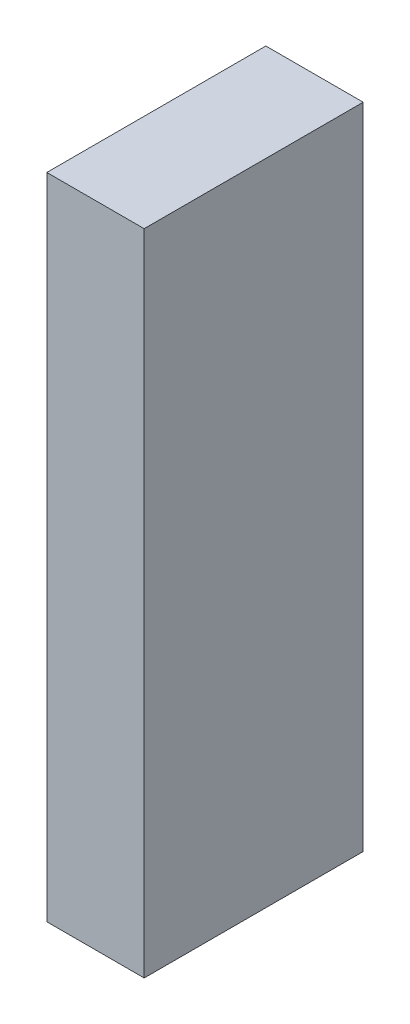
ISO-10303-21;
HEADER;
FILE_DESCRIPTION(('STEP AP214'),'2;1');
FILE_NAME('part.step','',(''),(''),'','','');
FILE_SCHEMA(('AUTOMOTIVE_DESIGN { 1 0 10303 214 1 1 1 1 }'));
ENDSEC;
DATA;
#1=APPLICATION_CONTEXT('core data for automotive mechanical design processes');
#2=APPLICATION_PROTOCOL_DEFINITION('international standard','automotive_design',2000,#1);
#3=PRODUCT_CONTEXT('',#1,'mechanical');
#4=PRODUCT('Part','Part','',(#3));
#5=PRODUCT_RELATED_PRODUCT_CATEGORY('part','',(#4));
#6=PRODUCT_DEFINITION_FORMATION('','',#4);
#7=PRODUCT_DEFINITION_CONTEXT('part definition',#1,'design');
#8=PRODUCT_DEFINITION('design','',#6,#7);
#9=PRODUCT_DEFINITION_SHAPE('','',#8);
#10=(LENGTH_UNIT() NAMED_UNIT(*) SI_UNIT(.MILLI.,.METRE.));
#11=(NAMED_UNIT(*) PLANE_ANGLE_UNIT() SI_UNIT($,.RADIAN.));
#12=(NAMED_UNIT(*) SI_UNIT($,.STERADIAN.) SOLID_ANGLE_UNIT());
#13=UNCERTAINTY_MEASURE_WITH_UNIT(LENGTH_MEASURE(1.E-05),#10,'distance_accuracy_value','');
#14=(GEOMETRIC_REPRESENTATION_CONTEXT(3) GLOBAL_UNCERTAINTY_ASSIGNED_CONTEXT((#13)) GLOBAL_UNIT_ASSIGNED_CONTEXT((#10,
#11,#12)) REPRESENTATION_CONTEXT('',''));
#15=CARTESIAN_POINT('',(0.,0.,0.));
#16=DIRECTION('',(0.,0.,1.));
#17=DIRECTION('',(1.,0.,0.));
#18=AXIS2_PLACEMENT_3D('',#15,#16,#17);
#19=CARTESIAN_POINT('',(-10.8340585797146,40.,-105.756692970029));
#20=DIRECTION('',(-1.,0.,0.));
#21=DIRECTION('',(0.,0.,1.));
#22=AXIS2_PLACEMENT_3D('',#19,#20,#21);
#23=PLANE('',#22);
#24=DIRECTION('',(0.,0.,-1.));
#25=VECTOR('',#24,1.);
#26=CARTESIAN_POINT('',(-10.8340585797146,0.,-105.756692970029));
#27=LINE('',#26,#25);
#28=CARTESIAN_POINT('',(-10.8340585797146,0.,-92.2566929700289));
#29=VERTEX_POINT('',#28);
#30=CARTESIAN_POINT('',(-10.8340585797146,0.,-105.756692970029));
#31=VERTEX_POINT('',#30);
#32=EDGE_CURVE('E101',#29,#31,#27,.T.);
#33=ORIENTED_EDGE('',*,*,#32,.T.);
#34=DIRECTION('',(0.,-1.,0.));
#35=VECTOR('',#34,1.);
#36=CARTESIAN_POINT('',(-10.8340585797146,40.,-105.756692970029));
#37=LINE('',#36,#35);
#38=CARTESIAN_POINT('',(-10.8340585797146,40.,-105.756692970029));
#39=VERTEX_POINT('',#38);
#40=EDGE_CURVE('E11',#39,#31,#37,.T.);
#41=ORIENTED_EDGE('',*,*,#40,.F.);
#42=DIRECTION('',(0.,0.,-1.));
#43=VECTOR('',#42,1.);
#44=CARTESIAN_POINT('',(-10.8340585797146,40.,-105.756692970029));
#45=LINE('',#44,#43);
#46=CARTESIAN_POINT('',(-10.8340585797146,40.,-92.2566929700289));
#47=VERTEX_POINT('',#46);
#48=EDGE_CURVE('E89',#47,#39,#45,.T.);
#49=ORIENTED_EDGE('',*,*,#48,.F.);
#50=DIRECTION('',(0.,-1.,0.));
#51=VECTOR('',#50,1.);
#52=CARTESIAN_POINT('',(-10.8340585797146,40.,-92.2566929700289));
#53=LINE('',#52,#51);
#54=EDGE_CURVE('E97',#47,#29,#53,.T.);
#55=ORIENTED_EDGE('',*,*,#54,.T.);
#56=EDGE_LOOP('',(#33,#41,#49,#55));
#57=FACE_BOUND('',#56,.T.);
#58=ADVANCED_FACE('F38',(#57),#23,.F.);
#59=CARTESIAN_POINT('',(-10.8340585797146,40.,-105.756692970029));
#60=DIRECTION('',(0.,0.,1.));
#61=DIRECTION('',(1.,0.,0.));
#62=AXIS2_PLACEMENT_3D('',#59,#60,#61);
#63=PLANE('',#62);
#64=DIRECTION('',(-1.,0.,0.));
#65=VECTOR('',#64,1.);
#66=CARTESIAN_POINT('',(-10.8340585797146,0.,-105.756692970029));
#67=LINE('',#66,#65);
#68=CARTESIAN_POINT('',(-16.8340585797146,0.,-105.756692970029));
#69=VERTEX_POINT('',#68);
#70=EDGE_CURVE('E93',#31,#69,#67,.T.);
#71=ORIENTED_EDGE('',*,*,#70,.T.);
#72=DIRECTION('',(0.,-1.,0.));
#73=VECTOR('',#72,1.);
#74=CARTESIAN_POINT('',(-16.8340585797146,40.,-105.756692970029));
#75=LINE('',#74,#73);
#76=CARTESIAN_POINT('',(-16.8340585797146,40.,-105.756692970029));
#77=VERTEX_POINT('',#76);
#78=EDGE_CURVE('E46',#77,#69,#75,.T.);
#79=ORIENTED_EDGE('',*,*,#78,.F.);
#80=DIRECTION('',(-1.,0.,0.));
#81=VECTOR('',#80,1.);
#82=CARTESIAN_POINT('',(-10.8340585797146,40.,-105.756692970029));
#83=LINE('',#82,#81);
#84=EDGE_CURVE('E84',#39,#77,#83,.T.);
#85=ORIENTED_EDGE('',*,*,#84,.F.);
#86=ORIENTED_EDGE('',*,*,#40,.T.);
#87=EDGE_LOOP('',(#71,#79,#85,#86));
#88=FACE_BOUND('',#87,.T.);
#89=ADVANCED_FACE('F92',(#88),#63,.F.);
#90=CARTESIAN_POINT('',(-16.8340585797146,40.,-105.756692970029));
#91=DIRECTION('',(1.,0.,0.));
#92=DIRECTION('',(0.,0.,-1.));
#93=AXIS2_PLACEMENT_3D('',#90,#91,#92);
#94=PLANE('',#93);
#95=DIRECTION('',(0.,0.,1.));
#96=VECTOR('',#95,1.);
#97=CARTESIAN_POINT('',(-16.8340585797146,0.,-105.756692970029));
#98=LINE('',#97,#96);
#99=CARTESIAN_POINT('',(-16.8340585797146,0.,-92.2566929700289));
#100=VERTEX_POINT('',#99);
#101=EDGE_CURVE('E71',#69,#100,#98,.T.);
#102=ORIENTED_EDGE('',*,*,#101,.T.);
#103=DIRECTION('',(0.,-1.,0.));
#104=VECTOR('',#103,1.);
#105=CARTESIAN_POINT('',(-16.8340585797146,40.,-92.2566929700289));
#106=LINE('',#105,#104);
#107=CARTESIAN_POINT('',(-16.8340585797146,40.,-92.2566929700289));
#108=VERTEX_POINT('',#107);
#109=EDGE_CURVE('E94',#108,#100,#106,.T.);
#110=ORIENTED_EDGE('',*,*,#109,.F.);
#111=DIRECTION('',(0.,0.,1.));
#112=VECTOR('',#111,1.);
#113=CARTESIAN_POINT('',(-16.8340585797146,40.,-105.756692970029));
#114=LINE('',#113,#112);
#115=EDGE_CURVE('E87',#77,#108,#114,.T.);
#116=ORIENTED_EDGE('',*,*,#115,.F.);
#117=ORIENTED_EDGE('',*,*,#78,.T.);
#118=EDGE_LOOP('',(#102,#110,#116,#117));
#119=FACE_BOUND('',#118,.T.);
#120=ADVANCED_FACE('F95',(#119),#94,.F.);
#121=CARTESIAN_POINT('',(-10.8340585797146,40.,-92.2566929700289));
#122=DIRECTION('',(0.,0.,-1.));
#123=DIRECTION('',(-1.,0.,0.));
#124=AXIS2_PLACEMENT_3D('',#121,#122,#123);
#125=PLANE('',#124);
#126=DIRECTION('',(1.,0.,0.));
#127=VECTOR('',#126,1.);
#128=CARTESIAN_POINT('',(-10.8340585797146,0.,-92.2566929700289));
#129=LINE('',#128,#127);
#130=EDGE_CURVE('E77',#100,#29,#129,.T.);
#131=ORIENTED_EDGE('',*,*,#130,.T.);
#132=ORIENTED_EDGE('',*,*,#54,.F.);
#133=DIRECTION('',(1.,0.,0.));
#134=VECTOR('',#133,1.);
#135=CARTESIAN_POINT('',(-10.8340585797146,40.,-92.2566929700289));
#136=LINE('',#135,#134);
#137=EDGE_CURVE('E54',#108,#47,#136,.T.);
#138=ORIENTED_EDGE('',*,*,#137,.F.);
#139=ORIENTED_EDGE('',*,*,#109,.T.);
#140=EDGE_LOOP('',(#131,#132,#138,#139));
#141=FACE_BOUND('',#140,.T.);
#142=ADVANCED_FACE('F108',(#141),#125,.F.);
#143=CARTESIAN_POINT('',(0.,40.,0.));
#144=DIRECTION('',(0.,-1.,0.));
#145=DIRECTION('',(0.,0.,-1.));
#146=AXIS2_PLACEMENT_3D('',#143,#144,#145);
#147=PLANE('',#146);
#148=ORIENTED_EDGE('',*,*,#48,.T.);
#149=ORIENTED_EDGE('',*,*,#84,.T.);
#150=ORIENTED_EDGE('',*,*,#115,.T.);
#151=ORIENTED_EDGE('',*,*,#137,.T.);
#152=EDGE_LOOP('',(#148,#149,#150,#151));
#153=FACE_BOUND('',#152,.T.);
#154=ADVANCED_FACE('F85',(#153),#147,.F.);
#155=CARTESIAN_POINT('',(0.,0.,0.));
#156=DIRECTION('',(0.,-1.,0.));
#157=DIRECTION('',(0.,0.,-1.));
#158=AXIS2_PLACEMENT_3D('',#155,#156,#157);
#159=PLANE('',#158);
#160=ORIENTED_EDGE('',*,*,#32,.F.);
#161=ORIENTED_EDGE('',*,*,#130,.F.);
#162=ORIENTED_EDGE('',*,*,#101,.F.);
#163=ORIENTED_EDGE('',*,*,#70,.F.);
#164=EDGE_LOOP('',(#160,#161,#162,#163));
#165=FACE_BOUND('',#164,.T.);
#166=ADVANCED_FACE('F111',(#165),#159,.T.);
#167=CLOSED_SHELL('',(#58,#89,#120,#142,#154,#166));
#168=MANIFOLD_SOLID_BREP('B2',#167);
#169=ADVANCED_BREP_SHAPE_REPRESENTATION('',(#18,#168),#14);
#170=SHAPE_DEFINITION_REPRESENTATION(#9,#169);
ENDSEC;
END-ISO-10303-21;
